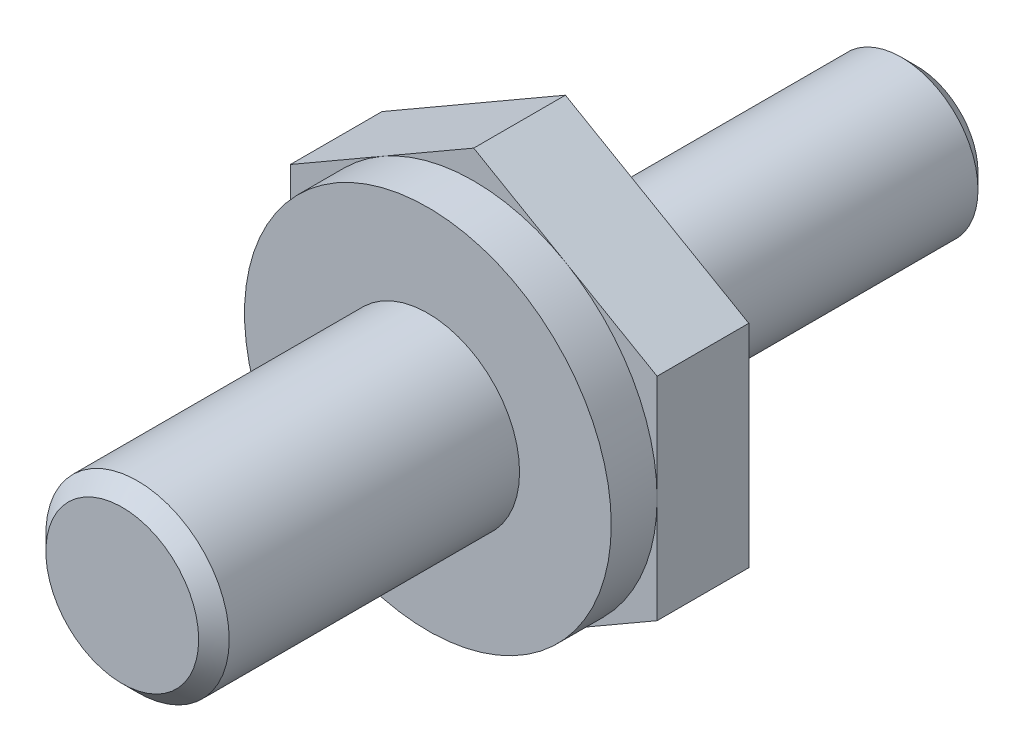
ISO-10303-21;
HEADER;
FILE_DESCRIPTION(('STEP AP214'),'2;1');
FILE_NAME('part.step','',(''),(''),'','','');
FILE_SCHEMA(('AUTOMOTIVE_DESIGN { 1 0 10303 214 1 1 1 1 }'));
ENDSEC;
DATA;
#1=APPLICATION_CONTEXT('core data for automotive mechanical design processes');
#2=APPLICATION_PROTOCOL_DEFINITION('international standard','automotive_design',2000,#1);
#3=PRODUCT_CONTEXT('',#1,'mechanical');
#4=PRODUCT('Part','Part','',(#3));
#5=PRODUCT_RELATED_PRODUCT_CATEGORY('part','',(#4));
#6=PRODUCT_DEFINITION_FORMATION('','',#4);
#7=PRODUCT_DEFINITION_CONTEXT('part definition',#1,'design');
#8=PRODUCT_DEFINITION('design','',#6,#7);
#9=PRODUCT_DEFINITION_SHAPE('','',#8);
#10=(LENGTH_UNIT() NAMED_UNIT(*) SI_UNIT(.MILLI.,.METRE.));
#11=(NAMED_UNIT(*) PLANE_ANGLE_UNIT() SI_UNIT($,.RADIAN.));
#12=(NAMED_UNIT(*) SI_UNIT($,.STERADIAN.) SOLID_ANGLE_UNIT());
#13=UNCERTAINTY_MEASURE_WITH_UNIT(LENGTH_MEASURE(1.E-05),#10,'distance_accuracy_value','');
#14=(GEOMETRIC_REPRESENTATION_CONTEXT(3) GLOBAL_UNCERTAINTY_ASSIGNED_CONTEXT((#13)) GLOBAL_UNIT_ASSIGNED_CONTEXT((#10,
#11,#12)) REPRESENTATION_CONTEXT('',''));
#15=CARTESIAN_POINT('',(0.,0.,0.));
#16=DIRECTION('',(0.,0.,1.));
#17=DIRECTION('',(1.,0.,0.));
#18=AXIS2_PLACEMENT_3D('',#15,#16,#17);
#19=CARTESIAN_POINT('',(0.,0.,16.));
#20=DIRECTION('',(0.,0.,1.));
#21=DIRECTION('',(1.,0.,0.));
#22=AXIS2_PLACEMENT_3D('',#19,#20,#21);
#23=PLANE('',#22);
#24=CARTESIAN_POINT('',(0.,0.,16.));
#25=DIRECTION('',(0.,0.,1.));
#26=DIRECTION('',(1.,0.,0.));
#27=AXIS2_PLACEMENT_3D('',#24,#25,#26);
#28=CIRCLE('',#27,6.);
#29=CARTESIAN_POINT('',(6.,0.,16.));
#30=VERTEX_POINT('',#29);
#31=EDGE_CURVE('E131',#30,#30,#28,.T.);
#32=ORIENTED_EDGE('',*,*,#31,.T.);
#33=EDGE_LOOP('',(#32));
#34=FACE_BOUND('',#33,.T.);
#35=CARTESIAN_POINT('',(0.,0.,16.));
#36=DIRECTION('',(0.,0.,1.));
#37=DIRECTION('',(1.,0.,0.));
#38=AXIS2_PLACEMENT_3D('',#35,#36,#37);
#39=CIRCLE('',#38,3.);
#40=CARTESIAN_POINT('',(3.,0.,16.));
#41=VERTEX_POINT('',#40);
#42=EDGE_CURVE('E132',#41,#41,#39,.T.);
#43=ORIENTED_EDGE('',*,*,#42,.F.);
#44=EDGE_LOOP('',(#43));
#45=FACE_BOUND('',#44,.T.);
#46=ADVANCED_FACE('F31',(#34,#45),#23,.T.);
#47=CARTESIAN_POINT('',(-12.,0.,14.5));
#48=DIRECTION('',(0.,0.,-1.));
#49=DIRECTION('',(-1.,0.,0.));
#50=AXIS2_PLACEMENT_3D('',#47,#48,#49);
#51=PLANE('',#50);
#52=CARTESIAN_POINT('',(0.,0.,14.5));
#53=DIRECTION('',(0.,0.,1.));
#54=DIRECTION('',(1.,0.,0.));
#55=AXIS2_PLACEMENT_3D('',#52,#53,#54);
#56=CIRCLE('',#55,6.);
#57=CARTESIAN_POINT('',(6.,0.,14.5));
#58=VERTEX_POINT('',#57);
#59=CARTESIAN_POINT('',(3.,5.19615242270663,14.5));
#60=VERTEX_POINT('',#59);
#61=EDGE_CURVE('E126',#58,#60,#56,.T.);
#62=ORIENTED_EDGE('',*,*,#61,.F.);
#63=DIRECTION('',(0.,1.,0.));
#64=VECTOR('',#63,1.);
#65=CARTESIAN_POINT('',(6.,-3.46410161513776,14.5));
#66=LINE('',#65,#64);
#67=CARTESIAN_POINT('',(6.,3.46410161513775,14.5));
#68=VERTEX_POINT('',#67);
#69=EDGE_CURVE('E114',#58,#68,#66,.T.);
#70=ORIENTED_EDGE('',*,*,#69,.T.);
#71=DIRECTION('',(-0.866025403784439,0.5,0.));
#72=VECTOR('',#71,1.);
#73=CARTESIAN_POINT('',(6.,3.46410161513775,14.5));
#74=LINE('',#73,#72);
#75=EDGE_CURVE('E128',#68,#60,#74,.T.);
#76=ORIENTED_EDGE('',*,*,#75,.T.);
#77=EDGE_LOOP('',(#62,#70,#76));
#78=FACE_BOUND('',#77,.T.);
#79=ADVANCED_FACE('F127',(#78),#51,.F.);
#80=CARTESIAN_POINT('',(-3.,5.19615242270663,14.5));
#81=VERTEX_POINT('',#80);
#82=EDGE_CURVE('E134',#60,#81,#56,.T.);
#83=ORIENTED_EDGE('',*,*,#82,.F.);
#84=CARTESIAN_POINT('',(0.,6.92820323027551,14.5));
#85=VERTEX_POINT('',#84);
#86=EDGE_CURVE('E113',#60,#85,#74,.T.);
#87=ORIENTED_EDGE('',*,*,#86,.T.);
#88=DIRECTION('',(-0.866025403784439,-0.5,0.));
#89=VECTOR('',#88,1.);
#90=CARTESIAN_POINT('',(0.,6.92820323027551,14.5));
#91=LINE('',#90,#89);
#92=EDGE_CURVE('E152',#85,#81,#91,.T.);
#93=ORIENTED_EDGE('',*,*,#92,.T.);
#94=EDGE_LOOP('',(#83,#87,#93));
#95=FACE_BOUND('',#94,.T.);
#96=ADVANCED_FACE('F211',(#95),#51,.F.);
#97=CARTESIAN_POINT('',(-6.,0.,14.5));
#98=VERTEX_POINT('',#97);
#99=EDGE_CURVE('E54',#81,#98,#56,.T.);
#100=ORIENTED_EDGE('',*,*,#99,.F.);
#101=CARTESIAN_POINT('',(-6.,3.46410161513775,14.5));
#102=VERTEX_POINT('',#101);
#103=EDGE_CURVE('E151',#81,#102,#91,.T.);
#104=ORIENTED_EDGE('',*,*,#103,.T.);
#105=DIRECTION('',(0.,-1.,0.));
#106=VECTOR('',#105,1.);
#107=CARTESIAN_POINT('',(-6.,3.46410161513775,14.5));
#108=LINE('',#107,#106);
#109=EDGE_CURVE('E156',#102,#98,#108,.T.);
#110=ORIENTED_EDGE('',*,*,#109,.T.);
#111=EDGE_LOOP('',(#100,#104,#110));
#112=FACE_BOUND('',#111,.T.);
#113=ADVANCED_FACE('F364',(#112),#51,.F.);
#114=CARTESIAN_POINT('',(-3.,-5.19615242270663,14.5));
#115=VERTEX_POINT('',#114);
#116=EDGE_CURVE('E46',#98,#115,#56,.T.);
#117=ORIENTED_EDGE('',*,*,#116,.F.);
#118=CARTESIAN_POINT('',(-6.,-3.46410161513776,14.5));
#119=VERTEX_POINT('',#118);
#120=EDGE_CURVE('E155',#98,#119,#108,.T.);
#121=ORIENTED_EDGE('',*,*,#120,.T.);
#122=DIRECTION('',(0.866025403784439,-0.5,0.));
#123=VECTOR('',#122,1.);
#124=CARTESIAN_POINT('',(-6.,-3.46410161513776,14.5));
#125=LINE('',#124,#123);
#126=EDGE_CURVE('E145',#119,#115,#125,.T.);
#127=ORIENTED_EDGE('',*,*,#126,.T.);
#128=EDGE_LOOP('',(#117,#121,#127));
#129=FACE_BOUND('',#128,.T.);
#130=ADVANCED_FACE('F356',(#129),#51,.F.);
#131=CARTESIAN_POINT('',(3.,-5.19615242270663,14.5));
#132=VERTEX_POINT('',#131);
#133=EDGE_CURVE('E137',#115,#132,#56,.T.);
#134=ORIENTED_EDGE('',*,*,#133,.F.);
#135=CARTESIAN_POINT('',(0.,-6.92820323027551,14.5));
#136=VERTEX_POINT('',#135);
#137=EDGE_CURVE('E147',#115,#136,#125,.T.);
#138=ORIENTED_EDGE('',*,*,#137,.T.);
#139=DIRECTION('',(0.866025403784439,0.5,0.));
#140=VECTOR('',#139,1.);
#141=CARTESIAN_POINT('',(0.,-6.92820323027551,14.5));
#142=LINE('',#141,#140);
#143=EDGE_CURVE('E124',#136,#132,#142,.T.);
#144=ORIENTED_EDGE('',*,*,#143,.T.);
#145=EDGE_LOOP('',(#134,#138,#144));
#146=FACE_BOUND('',#145,.T.);
#147=ADVANCED_FACE('F349',(#146),#51,.F.);
#148=EDGE_CURVE('E107',#132,#58,#56,.T.);
#149=ORIENTED_EDGE('',*,*,#148,.F.);
#150=CARTESIAN_POINT('',(6.,-3.46410161513776,14.5));
#151=VERTEX_POINT('',#150);
#152=EDGE_CURVE('E109',#132,#151,#142,.T.);
#153=ORIENTED_EDGE('',*,*,#152,.T.);
#154=EDGE_CURVE('E103',#151,#58,#66,.T.);
#155=ORIENTED_EDGE('',*,*,#154,.T.);
#156=EDGE_LOOP('',(#149,#153,#155));
#157=FACE_BOUND('',#156,.T.);
#158=ADVANCED_FACE('F105',(#157),#51,.F.);
#159=CARTESIAN_POINT('',(-12.,0.,11.5));
#160=DIRECTION('',(0.,0.,-1.));
#161=DIRECTION('',(-1.,0.,0.));
#162=AXIS2_PLACEMENT_3D('',#159,#160,#161);
#163=PLANE('',#162);
#164=DIRECTION('',(0.866025403784439,-0.5,0.));
#165=VECTOR('',#164,1.);
#166=CARTESIAN_POINT('',(-6.,-3.46410161513776,11.5));
#167=LINE('',#166,#165);
#168=CARTESIAN_POINT('',(-6.,-3.46410161513776,11.5));
#169=VERTEX_POINT('',#168);
#170=CARTESIAN_POINT('',(0.,-6.92820323027551,11.5));
#171=VERTEX_POINT('',#170);
#172=EDGE_CURVE('E159',#169,#171,#167,.T.);
#173=ORIENTED_EDGE('',*,*,#172,.F.);
#174=DIRECTION('',(0.,-1.,0.));
#175=VECTOR('',#174,1.);
#176=CARTESIAN_POINT('',(-6.,3.46410161513775,11.5));
#177=LINE('',#176,#175);
#178=CARTESIAN_POINT('',(-6.,3.46410161513775,11.5));
#179=VERTEX_POINT('',#178);
#180=EDGE_CURVE('E170',#179,#169,#177,.T.);
#181=ORIENTED_EDGE('',*,*,#180,.F.);
#182=DIRECTION('',(-0.866025403784439,-0.5,0.));
#183=VECTOR('',#182,1.);
#184=CARTESIAN_POINT('',(0.,6.92820323027551,11.5));
#185=LINE('',#184,#183);
#186=CARTESIAN_POINT('',(0.,6.92820323027551,11.5));
#187=VERTEX_POINT('',#186);
#188=EDGE_CURVE('E168',#187,#179,#185,.T.);
#189=ORIENTED_EDGE('',*,*,#188,.F.);
#190=DIRECTION('',(-0.866025403784439,0.5,0.));
#191=VECTOR('',#190,1.);
#192=CARTESIAN_POINT('',(6.,3.46410161513775,11.5));
#193=LINE('',#192,#191);
#194=CARTESIAN_POINT('',(6.,3.46410161513775,11.5));
#195=VERTEX_POINT('',#194);
#196=EDGE_CURVE('E166',#195,#187,#193,.T.);
#197=ORIENTED_EDGE('',*,*,#196,.F.);
#198=DIRECTION('',(0.,1.,0.));
#199=VECTOR('',#198,1.);
#200=CARTESIAN_POINT('',(6.,-3.46410161513776,11.5));
#201=LINE('',#200,#199);
#202=CARTESIAN_POINT('',(6.,-3.46410161513776,11.5));
#203=VERTEX_POINT('',#202);
#204=EDGE_CURVE('E164',#203,#195,#201,.T.);
#205=ORIENTED_EDGE('',*,*,#204,.F.);
#206=DIRECTION('',(0.866025403784439,0.5,0.));
#207=VECTOR('',#206,1.);
#208=CARTESIAN_POINT('',(0.,-6.92820323027551,11.5));
#209=LINE('',#208,#207);
#210=EDGE_CURVE('E162',#171,#203,#209,.T.);
#211=ORIENTED_EDGE('',*,*,#210,.F.);
#212=EDGE_LOOP('',(#173,#181,#189,#197,#205,#211));
#213=FACE_BOUND('',#212,.T.);
#214=CARTESIAN_POINT('',(0.,0.,11.5));
#215=DIRECTION('',(0.,0.,-1.));
#216=DIRECTION('',(-1.,0.,0.));
#217=AXIS2_PLACEMENT_3D('',#214,#215,#216);
#218=CIRCLE('',#217,2.5);
#219=CARTESIAN_POINT('',(-2.5,0.,11.5));
#220=VERTEX_POINT('',#219);
#221=EDGE_CURVE('E262',#220,#220,#218,.F.);
#222=ORIENTED_EDGE('',*,*,#221,.T.);
#223=EDGE_LOOP('',(#222));
#224=FACE_BOUND('',#223,.T.);
#225=ADVANCED_FACE('F223',(#213,#224),#163,.T.);
#226=CARTESIAN_POINT('',(-6.,-3.46410161513776,14.5));
#227=DIRECTION('',(0.5,0.866025403784438,0.));
#228=DIRECTION('',(-0.866025403784439,0.5,0.));
#229=AXIS2_PLACEMENT_3D('',#226,#227,#228);
#230=PLANE('',#229);
#231=ORIENTED_EDGE('',*,*,#172,.T.);
#232=DIRECTION('',(0.,0.,-1.));
#233=VECTOR('',#232,1.);
#234=CARTESIAN_POINT('',(0.,-6.92820323027551,14.5));
#235=LINE('',#234,#233);
#236=EDGE_CURVE('E138',#136,#171,#235,.T.);
#237=ORIENTED_EDGE('',*,*,#236,.F.);
#238=ORIENTED_EDGE('',*,*,#137,.F.);
#239=ORIENTED_EDGE('',*,*,#126,.F.);
#240=DIRECTION('',(0.,0.,-1.));
#241=VECTOR('',#240,1.);
#242=CARTESIAN_POINT('',(-6.,-3.46410161513776,14.5));
#243=LINE('',#242,#241);
#244=EDGE_CURVE('E158',#119,#169,#243,.T.);
#245=ORIENTED_EDGE('',*,*,#244,.T.);
#246=EDGE_LOOP('',(#231,#237,#238,#239,#245));
#247=FACE_BOUND('',#246,.T.);
#248=ADVANCED_FACE('F226',(#247),#230,.F.);
#249=CARTESIAN_POINT('',(0.,-6.92820323027551,14.5));
#250=DIRECTION('',(-0.5,0.866025403784439,0.));
#251=DIRECTION('',(-0.866025403784439,-0.5,0.));
#252=AXIS2_PLACEMENT_3D('',#249,#250,#251);
#253=PLANE('',#252);
#254=ORIENTED_EDGE('',*,*,#210,.T.);
#255=DIRECTION('',(0.,0.,-1.));
#256=VECTOR('',#255,1.);
#257=CARTESIAN_POINT('',(6.,-3.46410161513776,14.5));
#258=LINE('',#257,#256);
#259=EDGE_CURVE('E140',#151,#203,#258,.T.);
#260=ORIENTED_EDGE('',*,*,#259,.F.);
#261=ORIENTED_EDGE('',*,*,#152,.F.);
#262=ORIENTED_EDGE('',*,*,#143,.F.);
#263=ORIENTED_EDGE('',*,*,#236,.T.);
#264=EDGE_LOOP('',(#254,#260,#261,#262,#263));
#265=FACE_BOUND('',#264,.T.);
#266=ADVANCED_FACE('F241',(#265),#253,.F.);
#267=CARTESIAN_POINT('',(6.,-3.46410161513776,14.5));
#268=DIRECTION('',(-1.,0.,0.));
#269=DIRECTION('',(0.,0.,1.));
#270=AXIS2_PLACEMENT_3D('',#267,#268,#269);
#271=PLANE('',#270);
#272=ORIENTED_EDGE('',*,*,#204,.T.);
#273=DIRECTION('',(0.,0.,-1.));
#274=VECTOR('',#273,1.);
#275=CARTESIAN_POINT('',(6.,3.46410161513775,14.5));
#276=LINE('',#275,#274);
#277=EDGE_CURVE('E120',#68,#195,#276,.T.);
#278=ORIENTED_EDGE('',*,*,#277,.F.);
#279=ORIENTED_EDGE('',*,*,#69,.F.);
#280=ORIENTED_EDGE('',*,*,#154,.F.);
#281=ORIENTED_EDGE('',*,*,#259,.T.);
#282=EDGE_LOOP('',(#272,#278,#279,#280,#281));
#283=FACE_BOUND('',#282,.T.);
#284=ADVANCED_FACE('F118',(#283),#271,.F.);
#285=CARTESIAN_POINT('',(6.,3.46410161513775,14.5));
#286=DIRECTION('',(-0.5,-0.866025403784439,0.));
#287=DIRECTION('',(0.866025403784439,-0.5,0.));
#288=AXIS2_PLACEMENT_3D('',#285,#286,#287);
#289=PLANE('',#288);
#290=ORIENTED_EDGE('',*,*,#196,.T.);
#291=DIRECTION('',(0.,0.,-1.));
#292=VECTOR('',#291,1.);
#293=CARTESIAN_POINT('',(0.,6.92820323027551,14.5));
#294=LINE('',#293,#292);
#295=EDGE_CURVE('E177',#85,#187,#294,.T.);
#296=ORIENTED_EDGE('',*,*,#295,.F.);
#297=ORIENTED_EDGE('',*,*,#86,.F.);
#298=ORIENTED_EDGE('',*,*,#75,.F.);
#299=ORIENTED_EDGE('',*,*,#277,.T.);
#300=EDGE_LOOP('',(#290,#296,#297,#298,#299));
#301=FACE_BOUND('',#300,.T.);
#302=ADVANCED_FACE('F234',(#301),#289,.F.);
#303=CARTESIAN_POINT('',(0.,6.92820323027551,14.5));
#304=DIRECTION('',(0.5,-0.866025403784439,0.));
#305=DIRECTION('',(0.866025403784439,0.5,0.));
#306=AXIS2_PLACEMENT_3D('',#303,#304,#305);
#307=PLANE('',#306);
#308=ORIENTED_EDGE('',*,*,#188,.T.);
#309=DIRECTION('',(0.,0.,-1.));
#310=VECTOR('',#309,1.);
#311=CARTESIAN_POINT('',(-6.,3.46410161513775,14.5));
#312=LINE('',#311,#310);
#313=EDGE_CURVE('E174',#102,#179,#312,.T.);
#314=ORIENTED_EDGE('',*,*,#313,.F.);
#315=ORIENTED_EDGE('',*,*,#103,.F.);
#316=ORIENTED_EDGE('',*,*,#92,.F.);
#317=ORIENTED_EDGE('',*,*,#295,.T.);
#318=EDGE_LOOP('',(#308,#314,#315,#316,#317));
#319=FACE_BOUND('',#318,.T.);
#320=ADVANCED_FACE('F230',(#319),#307,.F.);
#321=CARTESIAN_POINT('',(-6.,3.46410161513775,14.5));
#322=DIRECTION('',(1.,0.,0.));
#323=DIRECTION('',(0.,0.,-1.));
#324=AXIS2_PLACEMENT_3D('',#321,#322,#323);
#325=PLANE('',#324);
#326=ORIENTED_EDGE('',*,*,#180,.T.);
#327=ORIENTED_EDGE('',*,*,#244,.F.);
#328=ORIENTED_EDGE('',*,*,#120,.F.);
#329=ORIENTED_EDGE('',*,*,#109,.F.);
#330=ORIENTED_EDGE('',*,*,#313,.T.);
#331=EDGE_LOOP('',(#326,#327,#328,#329,#330));
#332=FACE_BOUND('',#331,.T.);
#333=ADVANCED_FACE('F220',(#332),#325,.F.);
#334=CARTESIAN_POINT('',(0.,0.,16.));
#335=DIRECTION('',(0.,0.,-1.));
#336=DIRECTION('',(-1.,0.,0.));
#337=AXIS2_PLACEMENT_3D('',#334,#335,#336);
#338=CYLINDRICAL_SURFACE('',#337,6.);
#339=ORIENTED_EDGE('',*,*,#31,.F.);
#340=EDGE_LOOP('',(#339));
#341=FACE_BOUND('',#340,.T.);
#342=ORIENTED_EDGE('',*,*,#61,.T.);
#343=ORIENTED_EDGE('',*,*,#82,.T.);
#344=ORIENTED_EDGE('',*,*,#99,.T.);
#345=ORIENTED_EDGE('',*,*,#116,.T.);
#346=ORIENTED_EDGE('',*,*,#133,.T.);
#347=ORIENTED_EDGE('',*,*,#148,.T.);
#348=EDGE_LOOP('',(#342,#343,#344,#345,#346,#347));
#349=FACE_BOUND('',#348,.T.);
#350=ADVANCED_FACE('F136',(#341,#349),#338,.T.);
#351=CARTESIAN_POINT('',(0.,0.,26.));
#352=DIRECTION('',(0.,0.,-1.));
#353=DIRECTION('',(-1.,0.,0.));
#354=AXIS2_PLACEMENT_3D('',#351,#352,#353);
#355=CYLINDRICAL_SURFACE('',#354,3.);
#356=CARTESIAN_POINT('',(0.,0.,25.5));
#357=DIRECTION('',(0.,0.,1.));
#358=DIRECTION('',(1.,0.,0.));
#359=AXIS2_PLACEMENT_3D('',#356,#357,#358);
#360=CIRCLE('',#359,3.);
#361=CARTESIAN_POINT('',(3.,0.,25.5));
#362=VERTEX_POINT('',#361);
#363=EDGE_CURVE('E185',#362,#362,#360,.F.);
#364=ORIENTED_EDGE('',*,*,#363,.T.);
#365=EDGE_LOOP('',(#364));
#366=FACE_BOUND('',#365,.T.);
#367=ORIENTED_EDGE('',*,*,#42,.T.);
#368=EDGE_LOOP('',(#367));
#369=FACE_BOUND('',#368,.T.);
#370=ADVANCED_FACE('F217',(#366,#369),#355,.T.);
#371=CARTESIAN_POINT('',(0.,0.,26.));
#372=DIRECTION('',(0.,0.,1.));
#373=DIRECTION('',(1.,0.,0.));
#374=AXIS2_PLACEMENT_3D('',#371,#372,#373);
#375=PLANE('',#374);
#376=CARTESIAN_POINT('',(0.,0.,26.));
#377=DIRECTION('',(0.,0.,1.));
#378=DIRECTION('',(1.,0.,0.));
#379=AXIS2_PLACEMENT_3D('',#376,#377,#378);
#380=CIRCLE('',#379,2.5);
#381=CARTESIAN_POINT('',(2.5,0.,26.));
#382=VERTEX_POINT('',#381);
#383=EDGE_CURVE('E182',#382,#382,#380,.T.);
#384=ORIENTED_EDGE('',*,*,#383,.T.);
#385=EDGE_LOOP('',(#384));
#386=FACE_BOUND('',#385,.T.);
#387=ADVANCED_FACE('F248',(#386),#375,.T.);
#388=CARTESIAN_POINT('',(0.,0.,26.));
#389=DIRECTION('',(0.,0.,-1.));
#390=DIRECTION('',(-1.,0.,0.));
#391=AXIS2_PLACEMENT_3D('',#388,#389,#390);
#392=CONICAL_SURFACE('',#391,2.5,0.785398163397449);
#393=ORIENTED_EDGE('',*,*,#363,.F.);
#394=EDGE_LOOP('',(#393));
#395=FACE_BOUND('',#394,.T.);
#396=ORIENTED_EDGE('',*,*,#383,.F.);
#397=EDGE_LOOP('',(#396));
#398=FACE_BOUND('',#397,.T.);
#399=ADVANCED_FACE('F201',(#395,#398),#392,.T.);
#400=CARTESIAN_POINT('',(0.,0.,0.));
#401=DIRECTION('',(0.,0.,1.));
#402=DIRECTION('',(1.,0.,0.));
#403=AXIS2_PLACEMENT_3D('',#400,#401,#402);
#404=PLANE('',#403);
#405=CARTESIAN_POINT('',(0.,0.,0.));
#406=DIRECTION('',(0.,0.,1.));
#407=DIRECTION('',(1.,0.,0.));
#408=AXIS2_PLACEMENT_3D('',#405,#406,#407);
#409=CIRCLE('',#408,2.);
#410=CARTESIAN_POINT('',(2.,0.,0.));
#411=VERTEX_POINT('',#410);
#412=EDGE_CURVE('E11',#411,#411,#409,.F.);
#413=ORIENTED_EDGE('',*,*,#412,.T.);
#414=EDGE_LOOP('',(#413));
#415=FACE_BOUND('',#414,.T.);
#416=ADVANCED_FACE('F194',(#415),#404,.F.);
#417=CARTESIAN_POINT('',(0.,0.,0.5));
#418=DIRECTION('',(0.,0.,1.));
#419=DIRECTION('',(1.,0.,0.));
#420=AXIS2_PLACEMENT_3D('',#417,#418,#419);
#421=CONICAL_SURFACE('',#420,2.5,0.78539816339745);
#422=ORIENTED_EDGE('',*,*,#412,.F.);
#423=EDGE_LOOP('',(#422));
#424=FACE_BOUND('',#423,.T.);
#425=CARTESIAN_POINT('',(0.,0.,0.5));
#426=DIRECTION('',(0.,0.,1.));
#427=DIRECTION('',(1.,0.,0.));
#428=AXIS2_PLACEMENT_3D('',#425,#426,#427);
#429=CIRCLE('',#428,2.5);
#430=CARTESIAN_POINT('',(2.5,0.,0.5));
#431=VERTEX_POINT('',#430);
#432=EDGE_CURVE('E39',#431,#431,#429,.T.);
#433=ORIENTED_EDGE('',*,*,#432,.F.);
#434=EDGE_LOOP('',(#433));
#435=FACE_BOUND('',#434,.T.);
#436=ADVANCED_FACE('F33',(#424,#435),#421,.T.);
#437=CARTESIAN_POINT('',(0.,0.,10.));
#438=DIRECTION('',(0.,0.,-1.));
#439=DIRECTION('',(-1.,0.,0.));
#440=AXIS2_PLACEMENT_3D('',#437,#438,#439);
#441=CYLINDRICAL_SURFACE('',#440,2.5);
#442=ORIENTED_EDGE('',*,*,#432,.T.);
#443=EDGE_LOOP('',(#442));
#444=FACE_BOUND('',#443,.T.);
#445=ORIENTED_EDGE('',*,*,#221,.F.);
#446=EDGE_LOOP('',(#445));
#447=FACE_BOUND('',#446,.T.);
#448=ADVANCED_FACE('F190',(#444,#447),#441,.T.);
#449=CLOSED_SHELL('',(#46,#79,#96,#113,#130,#147,#158,#225,#248,#266,#284,#302,#320,#333,#350,
#370,#387,#399,#416,#436,#448));
#450=MANIFOLD_SOLID_BREP('B2',#449);
#451=ADVANCED_BREP_SHAPE_REPRESENTATION('',(#18,#450),#14);
#452=SHAPE_DEFINITION_REPRESENTATION(#9,#451);
ENDSEC;
END-ISO-10303-21;
